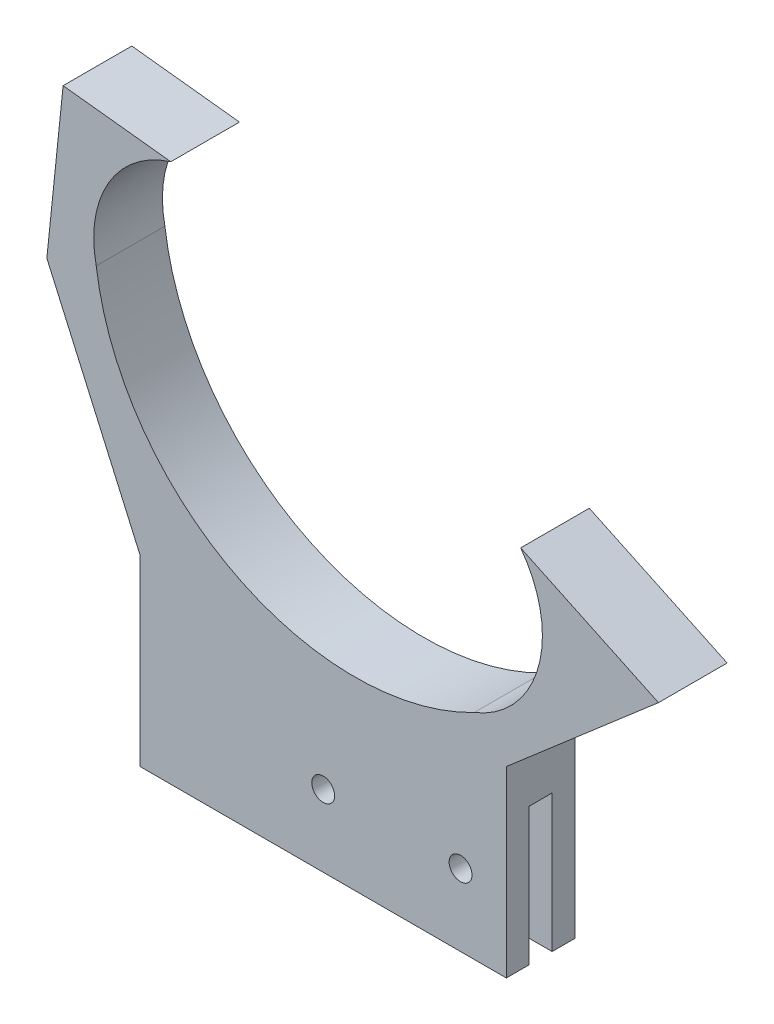
ISO-10303-21;
HEADER;
FILE_DESCRIPTION(('STEP AP214'),'2;1');
FILE_NAME('part.step','',(''),(''),'','','');
FILE_SCHEMA(('AUTOMOTIVE_DESIGN { 1 0 10303 214 1 1 1 1 }'));
ENDSEC;
DATA;
#1=APPLICATION_CONTEXT('core data for automotive mechanical design processes');
#2=APPLICATION_PROTOCOL_DEFINITION('international standard','automotive_design',2000,#1);
#3=PRODUCT_CONTEXT('',#1,'mechanical');
#4=PRODUCT('Part','Part','',(#3));
#5=PRODUCT_RELATED_PRODUCT_CATEGORY('part','',(#4));
#6=PRODUCT_DEFINITION_FORMATION('','',#4);
#7=PRODUCT_DEFINITION_CONTEXT('part definition',#1,'design');
#8=PRODUCT_DEFINITION('design','',#6,#7);
#9=PRODUCT_DEFINITION_SHAPE('','',#8);
#10=(LENGTH_UNIT() NAMED_UNIT(*) SI_UNIT(.MILLI.,.METRE.));
#11=(NAMED_UNIT(*) PLANE_ANGLE_UNIT() SI_UNIT($,.RADIAN.));
#12=(NAMED_UNIT(*) SI_UNIT($,.STERADIAN.) SOLID_ANGLE_UNIT());
#13=UNCERTAINTY_MEASURE_WITH_UNIT(LENGTH_MEASURE(1.E-05),#10,'distance_accuracy_value','');
#14=(GEOMETRIC_REPRESENTATION_CONTEXT(3) GLOBAL_UNCERTAINTY_ASSIGNED_CONTEXT((#13)) GLOBAL_UNIT_ASSIGNED_CONTEXT((#10,
#11,#12)) REPRESENTATION_CONTEXT('',''));
#15=CARTESIAN_POINT('',(0.,0.,0.));
#16=DIRECTION('',(0.,0.,1.));
#17=DIRECTION('',(1.,0.,0.));
#18=AXIS2_PLACEMENT_3D('',#15,#16,#17);
#19=CARTESIAN_POINT('',(0.,0.,-4.7625));
#20=DIRECTION('',(0.,0.,-1.));
#21=DIRECTION('',(-1.,0.,0.));
#22=AXIS2_PLACEMENT_3D('',#19,#20,#21);
#23=PLANE('',#22);
#24=CARTESIAN_POINT('',(25.4,9.97566590254973,-4.7625));
#25=DIRECTION('',(0.,0.,1.));
#26=DIRECTION('',(1.,0.,0.));
#27=AXIS2_PLACEMENT_3D('',#24,#25,#26);
#28=CIRCLE('',#27,1.5875);
#29=CARTESIAN_POINT('',(23.8125,9.97566590254973,-4.7625));
#30=VERTEX_POINT('',#29);
#31=EDGE_CURVE('E327',#30,#30,#28,.T.);
#32=ORIENTED_EDGE('',*,*,#31,.T.);
#33=EDGE_LOOP('',(#32));
#34=FACE_BOUND('',#33,.T.);
#35=DIRECTION('',(0.,1.,0.));
#36=VECTOR('',#35,1.);
#37=CARTESIAN_POINT('',(0.,0.,-4.7625));
#38=LINE('',#37,#36);
#39=CARTESIAN_POINT('',(0.,0.,-4.7625));
#40=VERTEX_POINT('',#39);
#41=CARTESIAN_POINT('',(0.,25.4,-4.7625));
#42=VERTEX_POINT('',#41);
#43=EDGE_CURVE('E351',#40,#42,#38,.T.);
#44=ORIENTED_EDGE('',*,*,#43,.T.);
#45=DIRECTION('',(0.404870913564751,-0.914373853163597,0.));
#46=VECTOR('',#45,1.);
#47=CARTESIAN_POINT('',(0.,25.4,-4.7625));
#48=LINE('',#47,#46);
#49=CARTESIAN_POINT('',(-12.9265765021164,54.5938076271904,-4.7625));
#50=VERTEX_POINT('',#49);
#51=EDGE_CURVE('E223',#50,#42,#48,.T.);
#52=ORIENTED_EDGE('',*,*,#51,.F.);
#53=DIRECTION('',(-0.10275000045706,-0.994707211900102,0.));
#54=VECTOR('',#53,1.);
#55=CARTESIAN_POINT('',(-10.6693086949744,76.4460758215097,-4.7625));
#56=LINE('',#55,#54);
#57=CARTESIAN_POINT('',(-10.6693086949744,76.4460758215097,-4.7625));
#58=VERTEX_POINT('',#57);
#59=EDGE_CURVE('E219',#58,#50,#56,.T.);
#60=ORIENTED_EDGE('',*,*,#59,.F.);
#61=DIRECTION('',(-0.993788616852398,0.111284253219387,0.));
#62=VECTOR('',#61,1.);
#63=CARTESIAN_POINT('',(4.26443102048918,74.7737985949182,-4.7625));
#64=LINE('',#63,#62);
#65=CARTESIAN_POINT('',(4.26443102048918,74.7737985949182,-4.7625));
#66=VERTEX_POINT('',#65);
#67=EDGE_CURVE('E215',#66,#58,#64,.T.);
#68=ORIENTED_EDGE('',*,*,#67,.F.);
#69=CARTESIAN_POINT('',(8.70516464672511,60.3124534404625,-4.7625));
#70=DIRECTION('',(0.,0.,-1.));
#71=DIRECTION('',(-1.,0.,0.));
#72=AXIS2_PLACEMENT_3D('',#69,#70,#71);
#73=CIRCLE('',#72,15.1278094519822);
#74=CARTESIAN_POINT('',(-6.07855098401486,57.1042809131666,-4.7625));
#75=VERTEX_POINT('',#74);
#76=EDGE_CURVE('E199',#75,#66,#73,.T.);
#77=ORIENTED_EDGE('',*,*,#76,.F.);
#78=CARTESIAN_POINT('',(29.7862914139128,61.8197221889093,-4.7625));
#79=DIRECTION('',(0.,0.,-1.));
#80=DIRECTION('',(1.,0.,0.));
#81=AXIS2_PLACEMENT_3D('',#78,#79,#80);
#82=CIRCLE('',#81,36.1735028253163);
#83=CARTESIAN_POINT('',(46.3568676440156,29.664811054597,-4.7625));
#84=VERTEX_POINT('',#83);
#85=EDGE_CURVE('E179',#84,#75,#82,.T.);
#86=ORIENTED_EDGE('',*,*,#85,.F.);
#87=CARTESIAN_POINT('',(40.7687496853365,43.6225751318325,-4.7625));
#88=DIRECTION('',(0.,0.,-1.));
#89=DIRECTION('',(1.,0.,0.));
#90=AXIS2_PLACEMENT_3D('',#87,#88,#89);
#91=CIRCLE('',#90,15.0348342310741);
#92=CARTESIAN_POINT('',(52.7873155231651,52.6558644307344,-4.7625));
#93=VERTEX_POINT('',#92);
#94=EDGE_CURVE('E195',#93,#84,#91,.T.);
#95=ORIENTED_EDGE('',*,*,#94,.F.);
#96=DIRECTION('',(-0.904126563918034,0.427264738093104,0.));
#97=VECTOR('',#96,1.);
#98=CARTESIAN_POINT('',(71.9024825063904,43.6225751318325,-4.7625));
#99=LINE('',#98,#97);
#100=CARTESIAN_POINT('',(71.9024825063904,43.6225751318325,-4.7625));
#101=VERTEX_POINT('',#100);
#102=EDGE_CURVE('E188',#101,#93,#99,.T.);
#103=ORIENTED_EDGE('',*,*,#102,.F.);
#104=DIRECTION('',(0.75686374423358,0.653572698836729,0.));
#105=VECTOR('',#104,1.);
#106=CARTESIAN_POINT('',(50.8,25.4,-4.7625));
#107=LINE('',#106,#105);
#108=CARTESIAN_POINT('',(50.8,25.4,-4.7625));
#109=VERTEX_POINT('',#108);
#110=EDGE_CURVE('E227',#109,#101,#107,.T.);
#111=ORIENTED_EDGE('',*,*,#110,.F.);
#112=DIRECTION('',(0.,1.,0.));
#113=VECTOR('',#112,1.);
#114=CARTESIAN_POINT('',(50.8,0.,-4.7625));
#115=LINE('',#114,#113);
#116=CARTESIAN_POINT('',(50.8,0.,-4.7625));
#117=VERTEX_POINT('',#116);
#118=EDGE_CURVE('E348',#117,#109,#115,.T.);
#119=ORIENTED_EDGE('',*,*,#118,.F.);
#120=DIRECTION('',(1.,0.,0.));
#121=VECTOR('',#120,1.);
#122=CARTESIAN_POINT('',(0.,0.,-4.7625));
#123=LINE('',#122,#121);
#124=EDGE_CURVE('E343',#40,#117,#123,.T.);
#125=ORIENTED_EDGE('',*,*,#124,.F.);
#126=EDGE_LOOP('',(#44,#52,#60,#68,#77,#86,#95,#103,#111,#119,#125));
#127=FACE_BOUND('',#126,.T.);
#128=CARTESIAN_POINT('',(44.45,9.97566590254973,-4.7625));
#129=DIRECTION('',(0.,0.,1.));
#130=DIRECTION('',(1.,0.,0.));
#131=AXIS2_PLACEMENT_3D('',#128,#129,#130);
#132=CIRCLE('',#131,1.5875);
#133=CARTESIAN_POINT('',(42.8625,9.97566590254973,-4.7625));
#134=VERTEX_POINT('',#133);
#135=EDGE_CURVE('E354',#134,#134,#132,.T.);
#136=ORIENTED_EDGE('',*,*,#135,.T.);
#137=EDGE_LOOP('',(#136));
#138=FACE_BOUND('',#137,.T.);
#139=ADVANCED_FACE('F69',(#34,#127,#138),#23,.T.);
#140=CARTESIAN_POINT('',(0.,0.,4.7625));
#141=DIRECTION('',(-1.,0.,0.));
#142=DIRECTION('',(0.,0.,1.));
#143=AXIS2_PLACEMENT_3D('',#140,#141,#142);
#144=PLANE('',#143);
#145=DIRECTION('',(0.,1.,0.));
#146=VECTOR('',#145,1.);
#147=CARTESIAN_POINT('',(0.,0.,-1.5875));
#148=LINE('',#147,#146);
#149=CARTESIAN_POINT('',(0.,0.,-1.5875));
#150=VERTEX_POINT('',#149);
#151=CARTESIAN_POINT('',(0.,19.05,-1.5875));
#152=VERTEX_POINT('',#151);
#153=EDGE_CURVE('E361',#150,#152,#148,.T.);
#154=ORIENTED_EDGE('',*,*,#153,.T.);
#155=DIRECTION('',(0.,0.,1.));
#156=VECTOR('',#155,1.);
#157=CARTESIAN_POINT('',(0.,19.05,-4.7625));
#158=LINE('',#157,#156);
#159=CARTESIAN_POINT('',(0.,19.05,1.5875));
#160=VERTEX_POINT('',#159);
#161=EDGE_CURVE('E322',#152,#160,#158,.T.);
#162=ORIENTED_EDGE('',*,*,#161,.T.);
#163=DIRECTION('',(0.,1.,0.));
#164=VECTOR('',#163,1.);
#165=CARTESIAN_POINT('',(0.,0.,1.5875));
#166=LINE('',#165,#164);
#167=CARTESIAN_POINT('',(0.,0.,1.5875));
#168=VERTEX_POINT('',#167);
#169=EDGE_CURVE('E259',#168,#160,#166,.T.);
#170=ORIENTED_EDGE('',*,*,#169,.F.);
#171=DIRECTION('',(0.,0.,-1.));
#172=VECTOR('',#171,1.);
#173=CARTESIAN_POINT('',(0.,0.,4.7625));
#174=LINE('',#173,#172);
#175=CARTESIAN_POINT('',(0.,0.,4.7625));
#176=VERTEX_POINT('',#175);
#177=EDGE_CURVE('E305',#176,#168,#174,.T.);
#178=ORIENTED_EDGE('',*,*,#177,.F.);
#179=DIRECTION('',(0.,-1.,0.));
#180=VECTOR('',#179,1.);
#181=CARTESIAN_POINT('',(0.,19.05,4.7625));
#182=LINE('',#181,#180);
#183=CARTESIAN_POINT('',(0.,25.4,4.7625));
#184=VERTEX_POINT('',#183);
#185=EDGE_CURVE('E309',#184,#176,#182,.T.);
#186=ORIENTED_EDGE('',*,*,#185,.F.);
#187=DIRECTION('',(0.,0.,1.));
#188=VECTOR('',#187,1.);
#189=CARTESIAN_POINT('',(0.,25.4,-4.7625));
#190=LINE('',#189,#188);
#191=EDGE_CURVE('E323',#42,#184,#190,.T.);
#192=ORIENTED_EDGE('',*,*,#191,.F.);
#193=ORIENTED_EDGE('',*,*,#43,.F.);
#194=DIRECTION('',(0.,0.,-1.));
#195=VECTOR('',#194,1.);
#196=CARTESIAN_POINT('',(0.,0.,4.7625));
#197=LINE('',#196,#195);
#198=EDGE_CURVE('E347',#150,#40,#197,.T.);
#199=ORIENTED_EDGE('',*,*,#198,.F.);
#200=EDGE_LOOP('',(#154,#162,#170,#178,#186,#192,#193,#199));
#201=FACE_BOUND('',#200,.T.);
#202=ADVANCED_FACE('F383',(#201),#144,.T.);
#203=CARTESIAN_POINT('',(0.,0.,4.7625));
#204=DIRECTION('',(0.,1.,0.));
#205=DIRECTION('',(0.,0.,1.));
#206=AXIS2_PLACEMENT_3D('',#203,#204,#205);
#207=PLANE('',#206);
#208=DIRECTION('',(0.,0.,-1.));
#209=VECTOR('',#208,1.);
#210=CARTESIAN_POINT('',(50.8,0.,4.7625));
#211=LINE('',#210,#209);
#212=CARTESIAN_POINT('',(50.8,0.,-1.5875));
#213=VERTEX_POINT('',#212);
#214=EDGE_CURVE('E73',#213,#117,#211,.T.);
#215=ORIENTED_EDGE('',*,*,#214,.F.);
#216=DIRECTION('',(1.,0.,0.));
#217=VECTOR('',#216,1.);
#218=CARTESIAN_POINT('',(0.,0.,-1.5875));
#219=LINE('',#218,#217);
#220=EDGE_CURVE('E79',#150,#213,#219,.T.);
#221=ORIENTED_EDGE('',*,*,#220,.F.);
#222=ORIENTED_EDGE('',*,*,#198,.T.);
#223=ORIENTED_EDGE('',*,*,#124,.T.);
#224=EDGE_LOOP('',(#215,#221,#222,#223));
#225=FACE_BOUND('',#224,.T.);
#226=ADVANCED_FACE('F376',(#225),#207,.F.);
#227=CARTESIAN_POINT('',(50.8,0.,4.7625));
#228=DIRECTION('',(-1.,0.,0.));
#229=DIRECTION('',(0.,0.,1.));
#230=AXIS2_PLACEMENT_3D('',#227,#228,#229);
#231=PLANE('',#230);
#232=ORIENTED_EDGE('',*,*,#118,.T.);
#233=DIRECTION('',(0.,0.,1.));
#234=VECTOR('',#233,1.);
#235=CARTESIAN_POINT('',(50.8,25.4,-4.7625));
#236=LINE('',#235,#234);
#237=CARTESIAN_POINT('',(50.8,25.4,4.7625));
#238=VERTEX_POINT('',#237);
#239=EDGE_CURVE('E328',#109,#238,#236,.T.);
#240=ORIENTED_EDGE('',*,*,#239,.T.);
#241=DIRECTION('',(0.,1.,0.));
#242=VECTOR('',#241,1.);
#243=CARTESIAN_POINT('',(50.8,19.05,4.7625));
#244=LINE('',#243,#242);
#245=CARTESIAN_POINT('',(50.8,0.,4.7625));
#246=VERTEX_POINT('',#245);
#247=EDGE_CURVE('E318',#246,#238,#244,.T.);
#248=ORIENTED_EDGE('',*,*,#247,.F.);
#249=DIRECTION('',(0.,0.,-1.));
#250=VECTOR('',#249,1.);
#251=CARTESIAN_POINT('',(50.8,0.,4.7625));
#252=LINE('',#251,#250);
#253=CARTESIAN_POINT('',(50.8,0.,1.5875));
#254=VERTEX_POINT('',#253);
#255=EDGE_CURVE('E304',#246,#254,#252,.T.);
#256=ORIENTED_EDGE('',*,*,#255,.T.);
#257=DIRECTION('',(0.,1.,0.));
#258=VECTOR('',#257,1.);
#259=CARTESIAN_POINT('',(50.8,0.,1.5875));
#260=LINE('',#259,#258);
#261=CARTESIAN_POINT('',(50.8,19.05,1.5875));
#262=VERTEX_POINT('',#261);
#263=EDGE_CURVE('E279',#254,#262,#260,.T.);
#264=ORIENTED_EDGE('',*,*,#263,.T.);
#265=DIRECTION('',(0.,0.,1.));
#266=VECTOR('',#265,1.);
#267=CARTESIAN_POINT('',(50.8,19.05,-4.7625));
#268=LINE('',#267,#266);
#269=CARTESIAN_POINT('',(50.8,19.05,-1.5875));
#270=VERTEX_POINT('',#269);
#271=EDGE_CURVE('E331',#270,#262,#268,.T.);
#272=ORIENTED_EDGE('',*,*,#271,.F.);
#273=DIRECTION('',(0.,1.,0.));
#274=VECTOR('',#273,1.);
#275=CARTESIAN_POINT('',(50.8,0.,-1.5875));
#276=LINE('',#275,#274);
#277=EDGE_CURVE('E12',#213,#270,#276,.T.);
#278=ORIENTED_EDGE('',*,*,#277,.F.);
#279=ORIENTED_EDGE('',*,*,#214,.T.);
#280=EDGE_LOOP('',(#232,#240,#248,#256,#264,#272,#278,#279));
#281=FACE_BOUND('',#280,.T.);
#282=ADVANCED_FACE('F409',(#281),#231,.F.);
#283=CARTESIAN_POINT('',(25.4,9.97566590254973,4.7625));
#284=DIRECTION('',(0.,0.,-1.));
#285=DIRECTION('',(-1.,0.,0.));
#286=AXIS2_PLACEMENT_3D('',#283,#284,#285);
#287=CYLINDRICAL_SURFACE('',#286,1.5875);
#288=CARTESIAN_POINT('',(25.4,9.97566590254973,-1.5875));
#289=DIRECTION('',(0.,0.,-1.));
#290=DIRECTION('',(-1.,0.,0.));
#291=AXIS2_PLACEMENT_3D('',#288,#289,#290);
#292=CIRCLE('',#291,1.5875);
#293=CARTESIAN_POINT('',(23.8125,9.97566590254973,-1.5875));
#294=VERTEX_POINT('',#293);
#295=EDGE_CURVE('E342',#294,#294,#292,.T.);
#296=CARTESIAN_POINT('',(23.8125,9.97566590254973,-1.5875));
#297=CARTESIAN_POINT('',(23.8125,9.97566590254973,-1.62057291666667));
#298=CARTESIAN_POINT('',(23.8125,9.97566590254973,-1.65364583333333));
#299=CARTESIAN_POINT('',(23.8125,9.97566590254973,-1.71979166666667));
#300=CARTESIAN_POINT('',(23.8125,9.97566590254973,-1.75286458333333));
#301=CARTESIAN_POINT('',(23.8125,9.97566590254973,-1.81901041666667));
#302=CARTESIAN_POINT('',(23.8125,9.97566590254973,-1.85208333333333));
#303=CARTESIAN_POINT('',(23.8125,9.97566590254973,-1.91822916666667));
#304=CARTESIAN_POINT('',(23.8125,9.97566590254973,-1.95130208333333));
#305=CARTESIAN_POINT('',(23.8125,9.97566590254973,-2.01744791666667));
#306=CARTESIAN_POINT('',(23.8125,9.97566590254973,-2.05052083333333));
#307=CARTESIAN_POINT('',(23.8125,9.97566590254973,-2.11666666666667));
#308=CARTESIAN_POINT('',(23.8125,9.97566590254973,-2.14973958333333));
#309=CARTESIAN_POINT('',(23.8125,9.97566590254973,-2.21588541666667));
#310=CARTESIAN_POINT('',(23.8125,9.97566590254973,-2.24895833333333));
#311=CARTESIAN_POINT('',(23.8125,9.97566590254973,-2.31510416666667));
#312=CARTESIAN_POINT('',(23.8125,9.97566590254973,-2.34817708333333));
#313=CARTESIAN_POINT('',(23.8125,9.97566590254973,-2.41432291666667));
#314=CARTESIAN_POINT('',(23.8125,9.97566590254973,-2.44739583333333));
#315=CARTESIAN_POINT('',(23.8125,9.97566590254973,-2.51354166666667));
#316=CARTESIAN_POINT('',(23.8125,9.97566590254973,-2.54661458333333));
#317=CARTESIAN_POINT('',(23.8125,9.97566590254973,-2.61276041666667));
#318=CARTESIAN_POINT('',(23.8125,9.97566590254973,-2.64583333333333));
#319=CARTESIAN_POINT('',(23.8125,9.97566590254973,-2.71197916666667));
#320=CARTESIAN_POINT('',(23.8125,9.97566590254973,-2.74505208333333));
#321=CARTESIAN_POINT('',(23.8125,9.97566590254973,-2.81119791666667));
#322=CARTESIAN_POINT('',(23.8125,9.97566590254973,-2.84427083333333));
#323=CARTESIAN_POINT('',(23.8125,9.97566590254973,-2.91041666666667));
#324=CARTESIAN_POINT('',(23.8125,9.97566590254973,-2.94348958333333));
#325=CARTESIAN_POINT('',(23.8125,9.97566590254973,-3.00963541666667));
#326=CARTESIAN_POINT('',(23.8125,9.97566590254973,-3.04270833333333));
#327=CARTESIAN_POINT('',(23.8125,9.97566590254973,-3.10885416666667));
#328=CARTESIAN_POINT('',(23.8125,9.97566590254973,-3.14192708333333));
#329=CARTESIAN_POINT('',(23.8125,9.97566590254973,-3.20807291666667));
#330=CARTESIAN_POINT('',(23.8125,9.97566590254973,-3.24114583333333));
#331=CARTESIAN_POINT('',(23.8125,9.97566590254973,-3.30729166666667));
#332=CARTESIAN_POINT('',(23.8125,9.97566590254973,-3.34036458333333));
#333=CARTESIAN_POINT('',(23.8125,9.97566590254973,-3.40651041666667));
#334=CARTESIAN_POINT('',(23.8125,9.97566590254973,-3.43958333333333));
#335=CARTESIAN_POINT('',(23.8125,9.97566590254973,-3.50572916666667));
#336=CARTESIAN_POINT('',(23.8125,9.97566590254973,-3.53880208333333));
#337=CARTESIAN_POINT('',(23.8125,9.97566590254973,-3.60494791666667));
#338=CARTESIAN_POINT('',(23.8125,9.97566590254973,-3.63802083333333));
#339=CARTESIAN_POINT('',(23.8125,9.97566590254973,-3.70416666666667));
#340=CARTESIAN_POINT('',(23.8125,9.97566590254973,-3.73723958333333));
#341=CARTESIAN_POINT('',(23.8125,9.97566590254973,-3.80338541666667));
#342=CARTESIAN_POINT('',(23.8125,9.97566590254973,-3.83645833333333));
#343=CARTESIAN_POINT('',(23.8125,9.97566590254973,-3.90260416666667));
#344=CARTESIAN_POINT('',(23.8125,9.97566590254973,-3.93567708333333));
#345=CARTESIAN_POINT('',(23.8125,9.97566590254973,-4.00182291666667));
#346=CARTESIAN_POINT('',(23.8125,9.97566590254973,-4.03489583333333));
#347=CARTESIAN_POINT('',(23.8125,9.97566590254973,-4.10104166666667));
#348=CARTESIAN_POINT('',(23.8125,9.97566590254973,-4.13411458333333));
#349=CARTESIAN_POINT('',(23.8125,9.97566590254973,-4.20026041666667));
#350=CARTESIAN_POINT('',(23.8125,9.97566590254973,-4.23333333333333));
#351=CARTESIAN_POINT('',(23.8125,9.97566590254973,-4.29947916666667));
#352=CARTESIAN_POINT('',(23.8125,9.97566590254973,-4.33255208333333));
#353=CARTESIAN_POINT('',(23.8125,9.97566590254973,-4.39869791666667));
#354=CARTESIAN_POINT('',(23.8125,9.97566590254973,-4.43177083333333));
#355=CARTESIAN_POINT('',(23.8125,9.97566590254973,-4.49791666666667));
#356=CARTESIAN_POINT('',(23.8125,9.97566590254973,-4.53098958333333));
#357=CARTESIAN_POINT('',(23.8125,9.97566590254973,-4.59713541666667));
#358=CARTESIAN_POINT('',(23.8125,9.97566590254973,-4.63020833333333));
#359=CARTESIAN_POINT('',(23.8125,9.97566590254973,-4.69635416666667));
#360=CARTESIAN_POINT('',(23.8125,9.97566590254973,-4.72942708333333));
#361=CARTESIAN_POINT('',(23.8125,9.97566590254973,-4.7625));
#362=B_SPLINE_CURVE_WITH_KNOTS('',3,(#296,#297,#298,#299,#300,#301,#302,#303,#304,#305,#306,
#307,#308,#309,#310,#311,#312,#313,#314,#315,#316,#317,#318,#319,#320,#321,#322,#323,#324,#325,
#326,#327,#328,#329,#330,#331,#332,#333,#334,#335,#336,#337,#338,#339,#340,#341,#342,#343,#344,
#345,#346,#347,#348,#349,#350,#351,#352,#353,#354,#355,#356,#357,#358,#359,#360,#361),
.UNSPECIFIED.,.F.,.F.,(4,2,2,2,2,2,2,2,2,2,2,2,2,2,2,2,2,2,2,2,2,2,2,2,2,2,2,2,2,2,2,2,4),(0.,
0.0992187500000004,0.1984375,0.29765625,0.396875000000001,0.496093750000001,0.5953125,
0.694531250000001,0.793750000000001,0.892968750000001,0.992187500000001,1.09140625,1.190625,
1.28984375,1.3890625,1.48828125,1.5875,1.68671875,1.7859375,1.88515625,1.984375,2.08359375,
2.1828125,2.28203125,2.38125,2.48046875,2.5796875,2.67890625,2.778125,2.87734375,2.9765625,
3.07578125,3.175),.UNSPECIFIED.);
#363=EDGE_CURVE('BSEAM430',#294,#30,#362,.T.);
#364=ORIENTED_EDGE('',*,*,#295,.F.);
#365=ORIENTED_EDGE('',*,*,#31,.F.);
#366=ORIENTED_EDGE('',*,*,#363,.T.);
#367=ORIENTED_EDGE('',*,*,#363,.F.);
#368=EDGE_LOOP('',(#364,#366,#365,#367));
#369=FACE_BOUND('',#368,.T.);
#370=ADVANCED_FACE('F430',(#369),#287,.F.);
#371=CARTESIAN_POINT('',(44.45,9.97566590254973,4.7625));
#372=DIRECTION('',(0.,0.,-1.));
#373=DIRECTION('',(-1.,0.,0.));
#374=AXIS2_PLACEMENT_3D('',#371,#372,#373);
#375=CYLINDRICAL_SURFACE('',#374,1.5875);
#376=CARTESIAN_POINT('',(44.45,9.97566590254973,-1.5875));
#377=DIRECTION('',(0.,0.,-1.));
#378=DIRECTION('',(-1.,0.,0.));
#379=AXIS2_PLACEMENT_3D('',#376,#377,#378);
#380=CIRCLE('',#379,1.5875);
#381=CARTESIAN_POINT('',(42.8625,9.97566590254973,-1.5875));
#382=VERTEX_POINT('',#381);
#383=EDGE_CURVE('E338',#382,#382,#380,.T.);
#384=CARTESIAN_POINT('',(42.8625,9.97566590254973,-1.5875));
#385=CARTESIAN_POINT('',(42.8625,9.97566590254973,-1.62057291666667));
#386=CARTESIAN_POINT('',(42.8625,9.97566590254973,-1.65364583333333));
#387=CARTESIAN_POINT('',(42.8625,9.97566590254973,-1.71979166666667));
#388=CARTESIAN_POINT('',(42.8625,9.97566590254973,-1.75286458333333));
#389=CARTESIAN_POINT('',(42.8625,9.97566590254973,-1.81901041666667));
#390=CARTESIAN_POINT('',(42.8625,9.97566590254973,-1.85208333333333));
#391=CARTESIAN_POINT('',(42.8625,9.97566590254973,-1.91822916666667));
#392=CARTESIAN_POINT('',(42.8625,9.97566590254973,-1.95130208333333));
#393=CARTESIAN_POINT('',(42.8625,9.97566590254973,-2.01744791666667));
#394=CARTESIAN_POINT('',(42.8625,9.97566590254973,-2.05052083333333));
#395=CARTESIAN_POINT('',(42.8625,9.97566590254973,-2.11666666666667));
#396=CARTESIAN_POINT('',(42.8625,9.97566590254973,-2.14973958333333));
#397=CARTESIAN_POINT('',(42.8625,9.97566590254973,-2.21588541666667));
#398=CARTESIAN_POINT('',(42.8625,9.97566590254973,-2.24895833333333));
#399=CARTESIAN_POINT('',(42.8625,9.97566590254973,-2.31510416666667));
#400=CARTESIAN_POINT('',(42.8625,9.97566590254973,-2.34817708333333));
#401=CARTESIAN_POINT('',(42.8625,9.97566590254973,-2.41432291666667));
#402=CARTESIAN_POINT('',(42.8625,9.97566590254973,-2.44739583333333));
#403=CARTESIAN_POINT('',(42.8625,9.97566590254973,-2.51354166666667));
#404=CARTESIAN_POINT('',(42.8625,9.97566590254973,-2.54661458333333));
#405=CARTESIAN_POINT('',(42.8625,9.97566590254973,-2.61276041666667));
#406=CARTESIAN_POINT('',(42.8625,9.97566590254973,-2.64583333333333));
#407=CARTESIAN_POINT('',(42.8625,9.97566590254973,-2.71197916666667));
#408=CARTESIAN_POINT('',(42.8625,9.97566590254973,-2.74505208333333));
#409=CARTESIAN_POINT('',(42.8625,9.97566590254973,-2.81119791666667));
#410=CARTESIAN_POINT('',(42.8625,9.97566590254973,-2.84427083333333));
#411=CARTESIAN_POINT('',(42.8625,9.97566590254973,-2.91041666666667));
#412=CARTESIAN_POINT('',(42.8625,9.97566590254973,-2.94348958333333));
#413=CARTESIAN_POINT('',(42.8625,9.97566590254973,-3.00963541666667));
#414=CARTESIAN_POINT('',(42.8625,9.97566590254973,-3.04270833333333));
#415=CARTESIAN_POINT('',(42.8625,9.97566590254973,-3.10885416666667));
#416=CARTESIAN_POINT('',(42.8625,9.97566590254973,-3.14192708333333));
#417=CARTESIAN_POINT('',(42.8625,9.97566590254973,-3.20807291666667));
#418=CARTESIAN_POINT('',(42.8625,9.97566590254973,-3.24114583333333));
#419=CARTESIAN_POINT('',(42.8625,9.97566590254973,-3.30729166666667));
#420=CARTESIAN_POINT('',(42.8625,9.97566590254973,-3.34036458333333));
#421=CARTESIAN_POINT('',(42.8625,9.97566590254973,-3.40651041666667));
#422=CARTESIAN_POINT('',(42.8625,9.97566590254973,-3.43958333333333));
#423=CARTESIAN_POINT('',(42.8625,9.97566590254973,-3.50572916666667));
#424=CARTESIAN_POINT('',(42.8625,9.97566590254973,-3.53880208333333));
#425=CARTESIAN_POINT('',(42.8625,9.97566590254973,-3.60494791666667));
#426=CARTESIAN_POINT('',(42.8625,9.97566590254973,-3.63802083333333));
#427=CARTESIAN_POINT('',(42.8625,9.97566590254973,-3.70416666666667));
#428=CARTESIAN_POINT('',(42.8625,9.97566590254973,-3.73723958333333));
#429=CARTESIAN_POINT('',(42.8625,9.97566590254973,-3.80338541666667));
#430=CARTESIAN_POINT('',(42.8625,9.97566590254973,-3.83645833333333));
#431=CARTESIAN_POINT('',(42.8625,9.97566590254973,-3.90260416666667));
#432=CARTESIAN_POINT('',(42.8625,9.97566590254973,-3.93567708333333));
#433=CARTESIAN_POINT('',(42.8625,9.97566590254973,-4.00182291666667));
#434=CARTESIAN_POINT('',(42.8625,9.97566590254973,-4.03489583333333));
#435=CARTESIAN_POINT('',(42.8625,9.97566590254973,-4.10104166666667));
#436=CARTESIAN_POINT('',(42.8625,9.97566590254973,-4.13411458333333));
#437=CARTESIAN_POINT('',(42.8625,9.97566590254973,-4.20026041666667));
#438=CARTESIAN_POINT('',(42.8625,9.97566590254973,-4.23333333333333));
#439=CARTESIAN_POINT('',(42.8625,9.97566590254973,-4.29947916666667));
#440=CARTESIAN_POINT('',(42.8625,9.97566590254973,-4.33255208333333));
#441=CARTESIAN_POINT('',(42.8625,9.97566590254973,-4.39869791666667));
#442=CARTESIAN_POINT('',(42.8625,9.97566590254973,-4.43177083333333));
#443=CARTESIAN_POINT('',(42.8625,9.97566590254973,-4.49791666666667));
#444=CARTESIAN_POINT('',(42.8625,9.97566590254973,-4.53098958333333));
#445=CARTESIAN_POINT('',(42.8625,9.97566590254973,-4.59713541666667));
#446=CARTESIAN_POINT('',(42.8625,9.97566590254973,-4.63020833333333));
#447=CARTESIAN_POINT('',(42.8625,9.97566590254973,-4.69635416666667));
#448=CARTESIAN_POINT('',(42.8625,9.97566590254973,-4.72942708333333));
#449=CARTESIAN_POINT('',(42.8625,9.97566590254973,-4.7625));
#450=B_SPLINE_CURVE_WITH_KNOTS('',3,(#384,#385,#386,#387,#388,#389,#390,#391,#392,#393,#394,
#395,#396,#397,#398,#399,#400,#401,#402,#403,#404,#405,#406,#407,#408,#409,#410,#411,#412,#413,
#414,#415,#416,#417,#418,#419,#420,#421,#422,#423,#424,#425,#426,#427,#428,#429,#430,#431,#432,
#433,#434,#435,#436,#437,#438,#439,#440,#441,#442,#443,#444,#445,#446,#447,#448,#449),
.UNSPECIFIED.,.F.,.F.,(4,2,2,2,2,2,2,2,2,2,2,2,2,2,2,2,2,2,2,2,2,2,2,2,2,2,2,2,2,2,2,2,4),(0.,
0.0992187500000004,0.1984375,0.29765625,0.396875000000001,0.496093750000001,0.5953125,
0.694531250000001,0.793750000000001,0.892968750000001,0.992187500000001,1.09140625,1.190625,
1.28984375,1.3890625,1.48828125,1.5875,1.68671875,1.7859375,1.88515625,1.984375,2.08359375,
2.1828125,2.28203125,2.38125,2.48046875,2.5796875,2.67890625,2.778125,2.87734375,2.9765625,
3.07578125,3.175),.UNSPECIFIED.);
#451=EDGE_CURVE('BSEAM71',#382,#134,#450,.T.);
#452=ORIENTED_EDGE('',*,*,#383,.F.);
#453=ORIENTED_EDGE('',*,*,#135,.F.);
#454=ORIENTED_EDGE('',*,*,#451,.T.);
#455=ORIENTED_EDGE('',*,*,#451,.F.);
#456=EDGE_LOOP('',(#452,#454,#453,#455));
#457=FACE_BOUND('',#456,.T.);
#458=ADVANCED_FACE('F71',(#457),#375,.F.);
#459=CARTESIAN_POINT('',(0.,0.,-1.5875));
#460=DIRECTION('',(0.,0.,-1.));
#461=DIRECTION('',(-1.,0.,0.));
#462=AXIS2_PLACEMENT_3D('',#459,#460,#461);
#463=PLANE('',#462);
#464=ORIENTED_EDGE('',*,*,#295,.T.);
#465=EDGE_LOOP('',(#464));
#466=FACE_BOUND('',#465,.T.);
#467=ORIENTED_EDGE('',*,*,#383,.T.);
#468=EDGE_LOOP('',(#467));
#469=FACE_BOUND('',#468,.T.);
#470=ORIENTED_EDGE('',*,*,#153,.F.);
#471=ORIENTED_EDGE('',*,*,#220,.T.);
#472=ORIENTED_EDGE('',*,*,#277,.T.);
#473=DIRECTION('',(1.,0.,0.));
#474=VECTOR('',#473,1.);
#475=CARTESIAN_POINT('',(0.,19.05,-1.5875));
#476=LINE('',#475,#474);
#477=EDGE_CURVE('E86',#152,#270,#476,.T.);
#478=ORIENTED_EDGE('',*,*,#477,.F.);
#479=EDGE_LOOP('',(#470,#471,#472,#478));
#480=FACE_BOUND('',#479,.T.);
#481=ADVANCED_FACE('F421',(#466,#469,#480),#463,.F.);
#482=CARTESIAN_POINT('',(0.,19.05,-4.7625));
#483=DIRECTION('',(0.,-1.,0.));
#484=DIRECTION('',(0.,0.,-1.));
#485=AXIS2_PLACEMENT_3D('',#482,#483,#484);
#486=PLANE('',#485);
#487=DIRECTION('',(1.,0.,0.));
#488=VECTOR('',#487,1.);
#489=CARTESIAN_POINT('',(0.,19.05,1.5875));
#490=LINE('',#489,#488);
#491=EDGE_CURVE('E276',#160,#262,#490,.T.);
#492=ORIENTED_EDGE('',*,*,#491,.F.);
#493=ORIENTED_EDGE('',*,*,#161,.F.);
#494=ORIENTED_EDGE('',*,*,#477,.T.);
#495=ORIENTED_EDGE('',*,*,#271,.T.);
#496=EDGE_LOOP('',(#492,#493,#494,#495));
#497=FACE_BOUND('',#496,.T.);
#498=ADVANCED_FACE('F418',(#497),#486,.T.);
#499=CARTESIAN_POINT('',(0.,0.,4.7625));
#500=DIRECTION('',(0.,0.,-1.));
#501=DIRECTION('',(-1.,0.,0.));
#502=AXIS2_PLACEMENT_3D('',#499,#500,#501);
#503=PLANE('',#502);
#504=ORIENTED_EDGE('',*,*,#185,.T.);
#505=DIRECTION('',(1.,0.,0.));
#506=VECTOR('',#505,1.);
#507=CARTESIAN_POINT('',(0.,0.,4.7625));
#508=LINE('',#507,#506);
#509=EDGE_CURVE('E300',#176,#246,#508,.T.);
#510=ORIENTED_EDGE('',*,*,#509,.T.);
#511=ORIENTED_EDGE('',*,*,#247,.T.);
#512=DIRECTION('',(0.75686374423358,0.653572698836729,0.));
#513=VECTOR('',#512,1.);
#514=CARTESIAN_POINT('',(50.8,25.4,4.7625));
#515=LINE('',#514,#513);
#516=CARTESIAN_POINT('',(71.9024825063904,43.6225751318325,4.7625));
#517=VERTEX_POINT('',#516);
#518=EDGE_CURVE('E210',#238,#517,#515,.T.);
#519=ORIENTED_EDGE('',*,*,#518,.T.);
#520=DIRECTION('',(-0.904126563918034,0.427264738093104,0.));
#521=VECTOR('',#520,1.);
#522=CARTESIAN_POINT('',(71.9024825063904,43.6225751318325,4.7625));
#523=LINE('',#522,#521);
#524=CARTESIAN_POINT('',(52.7873155231651,52.6558644307344,4.7625));
#525=VERTEX_POINT('',#524);
#526=EDGE_CURVE('E205',#517,#525,#523,.T.);
#527=ORIENTED_EDGE('',*,*,#526,.T.);
#528=CARTESIAN_POINT('',(40.7687496853365,43.6225751318325,4.7625));
#529=DIRECTION('',(0.,0.,-1.));
#530=DIRECTION('',(1.,0.,0.));
#531=AXIS2_PLACEMENT_3D('',#528,#529,#530);
#532=CIRCLE('',#531,15.0348342310741);
#533=CARTESIAN_POINT('',(46.3568676440156,29.664811054597,4.7625));
#534=VERTEX_POINT('',#533);
#535=EDGE_CURVE('E233',#525,#534,#532,.T.);
#536=ORIENTED_EDGE('',*,*,#535,.T.);
#537=CARTESIAN_POINT('',(29.7862914139128,61.8197221889093,4.7625));
#538=DIRECTION('',(0.,0.,-1.));
#539=DIRECTION('',(1.,0.,0.));
#540=AXIS2_PLACEMENT_3D('',#537,#538,#539);
#541=CIRCLE('',#540,36.1735028253163);
#542=CARTESIAN_POINT('',(-6.07855098401486,57.1042809131666,4.7625));
#543=VERTEX_POINT('',#542);
#544=EDGE_CURVE('E181',#534,#543,#541,.T.);
#545=ORIENTED_EDGE('',*,*,#544,.T.);
#546=CARTESIAN_POINT('',(8.70516464672511,60.3124534404625,4.7625));
#547=DIRECTION('',(0.,0.,-1.));
#548=DIRECTION('',(-1.,0.,0.));
#549=AXIS2_PLACEMENT_3D('',#546,#547,#548);
#550=CIRCLE('',#549,15.1278094519822);
#551=CARTESIAN_POINT('',(4.26443102048918,74.7737985949182,4.7625));
#552=VERTEX_POINT('',#551);
#553=EDGE_CURVE('E238',#543,#552,#550,.T.);
#554=ORIENTED_EDGE('',*,*,#553,.T.);
#555=DIRECTION('',(-0.993788616852398,0.111284253219387,0.));
#556=VECTOR('',#555,1.);
#557=CARTESIAN_POINT('',(4.26443102048918,74.7737985949182,4.7625));
#558=LINE('',#557,#556);
#559=CARTESIAN_POINT('',(-10.6693086949744,76.4460758215097,4.7625));
#560=VERTEX_POINT('',#559);
#561=EDGE_CURVE('E242',#552,#560,#558,.T.);
#562=ORIENTED_EDGE('',*,*,#561,.T.);
#563=DIRECTION('',(-0.10275000045706,-0.994707211900102,0.));
#564=VECTOR('',#563,1.);
#565=CARTESIAN_POINT('',(-10.6693086949744,76.4460758215097,4.7625));
#566=LINE('',#565,#564);
#567=CARTESIAN_POINT('',(-12.9265765021164,54.5938076271904,4.7625));
#568=VERTEX_POINT('',#567);
#569=EDGE_CURVE('E246',#560,#568,#566,.T.);
#570=ORIENTED_EDGE('',*,*,#569,.T.);
#571=DIRECTION('',(0.404870913564751,-0.914373853163597,0.));
#572=VECTOR('',#571,1.);
#573=CARTESIAN_POINT('',(0.,25.4,4.7625));
#574=LINE('',#573,#572);
#575=EDGE_CURVE('E250',#568,#184,#574,.T.);
#576=ORIENTED_EDGE('',*,*,#575,.T.);
#577=EDGE_LOOP('',(#504,#510,#511,#519,#527,#536,#545,#554,#562,#570,#576));
#578=FACE_BOUND('',#577,.T.);
#579=CARTESIAN_POINT('',(25.4,9.97566590254973,4.7625));
#580=DIRECTION('',(0.,0.,1.));
#581=DIRECTION('',(1.,0.,0.));
#582=AXIS2_PLACEMENT_3D('',#579,#580,#581);
#583=CIRCLE('',#582,1.5875);
#584=CARTESIAN_POINT('',(23.8125,9.97566590254973,4.7625));
#585=VERTEX_POINT('',#584);
#586=EDGE_CURVE('E296',#585,#585,#583,.T.);
#587=ORIENTED_EDGE('',*,*,#586,.F.);
#588=EDGE_LOOP('',(#587));
#589=FACE_BOUND('',#588,.T.);
#590=CARTESIAN_POINT('',(44.45,9.97566590254973,4.7625));
#591=DIRECTION('',(0.,0.,1.));
#592=DIRECTION('',(1.,0.,0.));
#593=AXIS2_PLACEMENT_3D('',#590,#591,#592);
#594=CIRCLE('',#593,1.5875);
#595=CARTESIAN_POINT('',(42.8625,9.97566590254973,4.7625));
#596=VERTEX_POINT('',#595);
#597=EDGE_CURVE('E292',#596,#596,#594,.T.);
#598=ORIENTED_EDGE('',*,*,#597,.F.);
#599=EDGE_LOOP('',(#598));
#600=FACE_BOUND('',#599,.T.);
#601=ADVANCED_FACE('F399',(#578,#589,#600),#503,.F.);
#602=CARTESIAN_POINT('',(25.4,9.97566590254973,4.7625));
#603=DIRECTION('',(0.,0.,-1.));
#604=DIRECTION('',(-1.,0.,0.));
#605=AXIS2_PLACEMENT_3D('',#602,#603,#604);
#606=CYLINDRICAL_SURFACE('',#605,1.5875);
#607=CARTESIAN_POINT('',(25.4,9.97566590254973,1.5875));
#608=DIRECTION('',(0.,0.,-1.));
#609=DIRECTION('',(-1.,0.,0.));
#610=AXIS2_PLACEMENT_3D('',#607,#608,#609);
#611=CIRCLE('',#610,1.5875);
#612=CARTESIAN_POINT('',(23.8125,9.97566590254973,1.5875));
#613=VERTEX_POINT('',#612);
#614=EDGE_CURVE('E288',#613,#613,#611,.T.);
#615=CARTESIAN_POINT('',(23.8125,9.97566590254973,4.7625));
#616=CARTESIAN_POINT('',(23.8125,9.97566590254973,4.72942708333333));
#617=CARTESIAN_POINT('',(23.8125,9.97566590254973,4.69635416666667));
#618=CARTESIAN_POINT('',(23.8125,9.97566590254973,4.63020833333333));
#619=CARTESIAN_POINT('',(23.8125,9.97566590254973,4.59713541666667));
#620=CARTESIAN_POINT('',(23.8125,9.97566590254973,4.53098958333333));
#621=CARTESIAN_POINT('',(23.8125,9.97566590254973,4.49791666666667));
#622=CARTESIAN_POINT('',(23.8125,9.97566590254973,4.43177083333333));
#623=CARTESIAN_POINT('',(23.8125,9.97566590254973,4.39869791666667));
#624=CARTESIAN_POINT('',(23.8125,9.97566590254973,4.33255208333333));
#625=CARTESIAN_POINT('',(23.8125,9.97566590254973,4.29947916666667));
#626=CARTESIAN_POINT('',(23.8125,9.97566590254973,4.23333333333333));
#627=CARTESIAN_POINT('',(23.8125,9.97566590254973,4.20026041666667));
#628=CARTESIAN_POINT('',(23.8125,9.97566590254973,4.13411458333333));
#629=CARTESIAN_POINT('',(23.8125,9.97566590254973,4.10104166666667));
#630=CARTESIAN_POINT('',(23.8125,9.97566590254973,4.03489583333333));
#631=CARTESIAN_POINT('',(23.8125,9.97566590254973,4.00182291666667));
#632=CARTESIAN_POINT('',(23.8125,9.97566590254973,3.93567708333333));
#633=CARTESIAN_POINT('',(23.8125,9.97566590254973,3.90260416666667));
#634=CARTESIAN_POINT('',(23.8125,9.97566590254973,3.83645833333333));
#635=CARTESIAN_POINT('',(23.8125,9.97566590254973,3.80338541666667));
#636=CARTESIAN_POINT('',(23.8125,9.97566590254973,3.73723958333333));
#637=CARTESIAN_POINT('',(23.8125,9.97566590254973,3.70416666666667));
#638=CARTESIAN_POINT('',(23.8125,9.97566590254973,3.63802083333333));
#639=CARTESIAN_POINT('',(23.8125,9.97566590254973,3.60494791666667));
#640=CARTESIAN_POINT('',(23.8125,9.97566590254973,3.53880208333333));
#641=CARTESIAN_POINT('',(23.8125,9.97566590254973,3.50572916666667));
#642=CARTESIAN_POINT('',(23.8125,9.97566590254973,3.43958333333333));
#643=CARTESIAN_POINT('',(23.8125,9.97566590254973,3.40651041666667));
#644=CARTESIAN_POINT('',(23.8125,9.97566590254973,3.34036458333333));
#645=CARTESIAN_POINT('',(23.8125,9.97566590254973,3.30729166666667));
#646=CARTESIAN_POINT('',(23.8125,9.97566590254973,3.24114583333333));
#647=CARTESIAN_POINT('',(23.8125,9.97566590254973,3.20807291666667));
#648=CARTESIAN_POINT('',(23.8125,9.97566590254973,3.14192708333333));
#649=CARTESIAN_POINT('',(23.8125,9.97566590254973,3.10885416666667));
#650=CARTESIAN_POINT('',(23.8125,9.97566590254973,3.04270833333333));
#651=CARTESIAN_POINT('',(23.8125,9.97566590254973,3.00963541666667));
#652=CARTESIAN_POINT('',(23.8125,9.97566590254973,2.94348958333333));
#653=CARTESIAN_POINT('',(23.8125,9.97566590254973,2.91041666666667));
#654=CARTESIAN_POINT('',(23.8125,9.97566590254973,2.84427083333333));
#655=CARTESIAN_POINT('',(23.8125,9.97566590254973,2.81119791666667));
#656=CARTESIAN_POINT('',(23.8125,9.97566590254973,2.74505208333333));
#657=CARTESIAN_POINT('',(23.8125,9.97566590254973,2.71197916666667));
#658=CARTESIAN_POINT('',(23.8125,9.97566590254973,2.64583333333333));
#659=CARTESIAN_POINT('',(23.8125,9.97566590254973,2.61276041666667));
#660=CARTESIAN_POINT('',(23.8125,9.97566590254973,2.54661458333333));
#661=CARTESIAN_POINT('',(23.8125,9.97566590254973,2.51354166666667));
#662=CARTESIAN_POINT('',(23.8125,9.97566590254973,2.44739583333333));
#663=CARTESIAN_POINT('',(23.8125,9.97566590254973,2.41432291666667));
#664=CARTESIAN_POINT('',(23.8125,9.97566590254973,2.34817708333333));
#665=CARTESIAN_POINT('',(23.8125,9.97566590254973,2.31510416666667));
#666=CARTESIAN_POINT('',(23.8125,9.97566590254973,2.24895833333333));
#667=CARTESIAN_POINT('',(23.8125,9.97566590254973,2.21588541666667));
#668=CARTESIAN_POINT('',(23.8125,9.97566590254973,2.14973958333333));
#669=CARTESIAN_POINT('',(23.8125,9.97566590254973,2.11666666666667));
#670=CARTESIAN_POINT('',(23.8125,9.97566590254973,2.05052083333333));
#671=CARTESIAN_POINT('',(23.8125,9.97566590254973,2.01744791666667));
#672=CARTESIAN_POINT('',(23.8125,9.97566590254973,1.95130208333333));
#673=CARTESIAN_POINT('',(23.8125,9.97566590254973,1.91822916666667));
#674=CARTESIAN_POINT('',(23.8125,9.97566590254973,1.85208333333333));
#675=CARTESIAN_POINT('',(23.8125,9.97566590254973,1.81901041666667));
#676=CARTESIAN_POINT('',(23.8125,9.97566590254973,1.75286458333333));
#677=CARTESIAN_POINT('',(23.8125,9.97566590254973,1.71979166666667));
#678=CARTESIAN_POINT('',(23.8125,9.97566590254973,1.65364583333333));
#679=CARTESIAN_POINT('',(23.8125,9.97566590254973,1.62057291666667));
#680=CARTESIAN_POINT('',(23.8125,9.97566590254973,1.5875));
#681=B_SPLINE_CURVE_WITH_KNOTS('',3,(#615,#616,#617,#618,#619,#620,#621,#622,#623,#624,#625,
#626,#627,#628,#629,#630,#631,#632,#633,#634,#635,#636,#637,#638,#639,#640,#641,#642,#643,#644,
#645,#646,#647,#648,#649,#650,#651,#652,#653,#654,#655,#656,#657,#658,#659,#660,#661,#662,#663,
#664,#665,#666,#667,#668,#669,#670,#671,#672,#673,#674,#675,#676,#677,#678,#679,#680),
.UNSPECIFIED.,.F.,.F.,(4,2,2,2,2,2,2,2,2,2,2,2,2,2,2,2,2,2,2,2,2,2,2,2,2,2,2,2,2,2,2,2,4),(0.,
0.0992187500000004,0.198437500000001,0.29765625,0.396875000000001,0.49609375,0.5953125,
0.694531250000001,0.79375,0.892968750000001,0.9921875,1.09140625,1.190625,1.28984375,1.3890625,
1.48828125,1.5875,1.68671875,1.7859375,1.88515625,1.984375,2.08359375,2.1828125,2.28203125,
2.38125,2.48046875,2.5796875,2.67890625,2.778125,2.87734375,2.9765625,3.07578125,3.175),.UNSPECIFIED.);
#682=EDGE_CURVE('BSEAM443',#585,#613,#681,.T.);
#683=ORIENTED_EDGE('',*,*,#586,.T.);
#684=ORIENTED_EDGE('',*,*,#614,.T.);
#685=ORIENTED_EDGE('',*,*,#682,.T.);
#686=ORIENTED_EDGE('',*,*,#682,.F.);
#687=EDGE_LOOP('',(#683,#685,#684,#686));
#688=FACE_BOUND('',#687,.T.);
#689=ADVANCED_FACE('F443',(#688),#606,.F.);
#690=CARTESIAN_POINT('',(0.,0.,4.7625));
#691=DIRECTION('',(0.,1.,0.));
#692=DIRECTION('',(0.,0.,1.));
#693=AXIS2_PLACEMENT_3D('',#690,#691,#692);
#694=PLANE('',#693);
#695=DIRECTION('',(1.,0.,0.));
#696=VECTOR('',#695,1.);
#697=CARTESIAN_POINT('',(0.,0.,1.5875));
#698=LINE('',#697,#696);
#699=EDGE_CURVE('E283',#168,#254,#698,.T.);
#700=ORIENTED_EDGE('',*,*,#699,.T.);
#701=ORIENTED_EDGE('',*,*,#255,.F.);
#702=ORIENTED_EDGE('',*,*,#509,.F.);
#703=ORIENTED_EDGE('',*,*,#177,.T.);
#704=EDGE_LOOP('',(#700,#701,#702,#703));
#705=FACE_BOUND('',#704,.T.);
#706=ADVANCED_FACE('F413',(#705),#694,.F.);
#707=CARTESIAN_POINT('',(44.45,9.97566590254973,4.7625));
#708=DIRECTION('',(0.,0.,-1.));
#709=DIRECTION('',(-1.,0.,0.));
#710=AXIS2_PLACEMENT_3D('',#707,#708,#709);
#711=CYLINDRICAL_SURFACE('',#710,1.5875);
#712=CARTESIAN_POINT('',(44.45,9.97566590254973,1.5875));
#713=DIRECTION('',(0.,0.,-1.));
#714=DIRECTION('',(-1.,0.,0.));
#715=AXIS2_PLACEMENT_3D('',#712,#713,#714);
#716=CIRCLE('',#715,1.5875);
#717=CARTESIAN_POINT('',(42.8625,9.97566590254973,1.5875));
#718=VERTEX_POINT('',#717);
#719=EDGE_CURVE('E287',#718,#718,#716,.T.);
#720=CARTESIAN_POINT('',(42.8625,9.97566590254973,4.7625));
#721=CARTESIAN_POINT('',(42.8625,9.97566590254973,4.72942708333333));
#722=CARTESIAN_POINT('',(42.8625,9.97566590254973,4.69635416666667));
#723=CARTESIAN_POINT('',(42.8625,9.97566590254973,4.63020833333333));
#724=CARTESIAN_POINT('',(42.8625,9.97566590254973,4.59713541666667));
#725=CARTESIAN_POINT('',(42.8625,9.97566590254973,4.53098958333333));
#726=CARTESIAN_POINT('',(42.8625,9.97566590254973,4.49791666666667));
#727=CARTESIAN_POINT('',(42.8625,9.97566590254973,4.43177083333333));
#728=CARTESIAN_POINT('',(42.8625,9.97566590254973,4.39869791666667));
#729=CARTESIAN_POINT('',(42.8625,9.97566590254973,4.33255208333333));
#730=CARTESIAN_POINT('',(42.8625,9.97566590254973,4.29947916666667));
#731=CARTESIAN_POINT('',(42.8625,9.97566590254973,4.23333333333333));
#732=CARTESIAN_POINT('',(42.8625,9.97566590254973,4.20026041666667));
#733=CARTESIAN_POINT('',(42.8625,9.97566590254973,4.13411458333333));
#734=CARTESIAN_POINT('',(42.8625,9.97566590254973,4.10104166666667));
#735=CARTESIAN_POINT('',(42.8625,9.97566590254973,4.03489583333333));
#736=CARTESIAN_POINT('',(42.8625,9.97566590254973,4.00182291666667));
#737=CARTESIAN_POINT('',(42.8625,9.97566590254973,3.93567708333333));
#738=CARTESIAN_POINT('',(42.8625,9.97566590254973,3.90260416666667));
#739=CARTESIAN_POINT('',(42.8625,9.97566590254973,3.83645833333333));
#740=CARTESIAN_POINT('',(42.8625,9.97566590254973,3.80338541666667));
#741=CARTESIAN_POINT('',(42.8625,9.97566590254973,3.73723958333333));
#742=CARTESIAN_POINT('',(42.8625,9.97566590254973,3.70416666666667));
#743=CARTESIAN_POINT('',(42.8625,9.97566590254973,3.63802083333333));
#744=CARTESIAN_POINT('',(42.8625,9.97566590254973,3.60494791666667));
#745=CARTESIAN_POINT('',(42.8625,9.97566590254973,3.53880208333333));
#746=CARTESIAN_POINT('',(42.8625,9.97566590254973,3.50572916666667));
#747=CARTESIAN_POINT('',(42.8625,9.97566590254973,3.43958333333333));
#748=CARTESIAN_POINT('',(42.8625,9.97566590254973,3.40651041666667));
#749=CARTESIAN_POINT('',(42.8625,9.97566590254973,3.34036458333333));
#750=CARTESIAN_POINT('',(42.8625,9.97566590254973,3.30729166666667));
#751=CARTESIAN_POINT('',(42.8625,9.97566590254973,3.24114583333333));
#752=CARTESIAN_POINT('',(42.8625,9.97566590254973,3.20807291666667));
#753=CARTESIAN_POINT('',(42.8625,9.97566590254973,3.14192708333333));
#754=CARTESIAN_POINT('',(42.8625,9.97566590254973,3.10885416666667));
#755=CARTESIAN_POINT('',(42.8625,9.97566590254973,3.04270833333333));
#756=CARTESIAN_POINT('',(42.8625,9.97566590254973,3.00963541666667));
#757=CARTESIAN_POINT('',(42.8625,9.97566590254973,2.94348958333333));
#758=CARTESIAN_POINT('',(42.8625,9.97566590254973,2.91041666666667));
#759=CARTESIAN_POINT('',(42.8625,9.97566590254973,2.84427083333333));
#760=CARTESIAN_POINT('',(42.8625,9.97566590254973,2.81119791666667));
#761=CARTESIAN_POINT('',(42.8625,9.97566590254973,2.74505208333333));
#762=CARTESIAN_POINT('',(42.8625,9.97566590254973,2.71197916666667));
#763=CARTESIAN_POINT('',(42.8625,9.97566590254973,2.64583333333333));
#764=CARTESIAN_POINT('',(42.8625,9.97566590254973,2.61276041666667));
#765=CARTESIAN_POINT('',(42.8625,9.97566590254973,2.54661458333333));
#766=CARTESIAN_POINT('',(42.8625,9.97566590254973,2.51354166666667));
#767=CARTESIAN_POINT('',(42.8625,9.97566590254973,2.44739583333333));
#768=CARTESIAN_POINT('',(42.8625,9.97566590254973,2.41432291666667));
#769=CARTESIAN_POINT('',(42.8625,9.97566590254973,2.34817708333333));
#770=CARTESIAN_POINT('',(42.8625,9.97566590254973,2.31510416666667));
#771=CARTESIAN_POINT('',(42.8625,9.97566590254973,2.24895833333333));
#772=CARTESIAN_POINT('',(42.8625,9.97566590254973,2.21588541666667));
#773=CARTESIAN_POINT('',(42.8625,9.97566590254973,2.14973958333333));
#774=CARTESIAN_POINT('',(42.8625,9.97566590254973,2.11666666666667));
#775=CARTESIAN_POINT('',(42.8625,9.97566590254973,2.05052083333333));
#776=CARTESIAN_POINT('',(42.8625,9.97566590254973,2.01744791666667));
#777=CARTESIAN_POINT('',(42.8625,9.97566590254973,1.95130208333333));
#778=CARTESIAN_POINT('',(42.8625,9.97566590254973,1.91822916666667));
#779=CARTESIAN_POINT('',(42.8625,9.97566590254973,1.85208333333333));
#780=CARTESIAN_POINT('',(42.8625,9.97566590254973,1.81901041666667));
#781=CARTESIAN_POINT('',(42.8625,9.97566590254973,1.75286458333333));
#782=CARTESIAN_POINT('',(42.8625,9.97566590254973,1.71979166666667));
#783=CARTESIAN_POINT('',(42.8625,9.97566590254973,1.65364583333333));
#784=CARTESIAN_POINT('',(42.8625,9.97566590254973,1.62057291666667));
#785=CARTESIAN_POINT('',(42.8625,9.97566590254973,1.5875));
#786=B_SPLINE_CURVE_WITH_KNOTS('',3,(#720,#721,#722,#723,#724,#725,#726,#727,#728,#729,#730,
#731,#732,#733,#734,#735,#736,#737,#738,#739,#740,#741,#742,#743,#744,#745,#746,#747,#748,#749,
#750,#751,#752,#753,#754,#755,#756,#757,#758,#759,#760,#761,#762,#763,#764,#765,#766,#767,#768,
#769,#770,#771,#772,#773,#774,#775,#776,#777,#778,#779,#780,#781,#782,#783,#784,#785),
.UNSPECIFIED.,.F.,.F.,(4,2,2,2,2,2,2,2,2,2,2,2,2,2,2,2,2,2,2,2,2,2,2,2,2,2,2,2,2,2,2,2,4),(0.,
0.0992187500000004,0.198437500000001,0.29765625,0.396875000000001,0.49609375,0.5953125,
0.694531250000001,0.79375,0.892968750000001,0.9921875,1.09140625,1.190625,1.28984375,1.3890625,
1.48828125,1.5875,1.68671875,1.7859375,1.88515625,1.984375,2.08359375,2.1828125,2.28203125,
2.38125,2.48046875,2.5796875,2.67890625,2.778125,2.87734375,2.9765625,3.07578125,3.175),.UNSPECIFIED.);
#787=EDGE_CURVE('BSEAM446',#596,#718,#786,.T.);
#788=ORIENTED_EDGE('',*,*,#597,.T.);
#789=ORIENTED_EDGE('',*,*,#719,.T.);
#790=ORIENTED_EDGE('',*,*,#787,.T.);
#791=ORIENTED_EDGE('',*,*,#787,.F.);
#792=EDGE_LOOP('',(#788,#790,#789,#791));
#793=FACE_BOUND('',#792,.T.);
#794=ADVANCED_FACE('F446',(#793),#711,.F.);
#795=CARTESIAN_POINT('',(0.,0.,1.5875));
#796=DIRECTION('',(0.,0.,-1.));
#797=DIRECTION('',(-1.,0.,0.));
#798=AXIS2_PLACEMENT_3D('',#795,#796,#797);
#799=PLANE('',#798);
#800=ORIENTED_EDGE('',*,*,#614,.F.);
#801=EDGE_LOOP('',(#800));
#802=FACE_BOUND('',#801,.T.);
#803=ORIENTED_EDGE('',*,*,#719,.F.);
#804=EDGE_LOOP('',(#803));
#805=FACE_BOUND('',#804,.T.);
#806=ORIENTED_EDGE('',*,*,#169,.T.);
#807=ORIENTED_EDGE('',*,*,#491,.T.);
#808=ORIENTED_EDGE('',*,*,#263,.F.);
#809=ORIENTED_EDGE('',*,*,#699,.F.);
#810=EDGE_LOOP('',(#806,#807,#808,#809));
#811=FACE_BOUND('',#810,.T.);
#812=ADVANCED_FACE('F452',(#802,#805,#811),#799,.T.);
#813=CARTESIAN_POINT('',(40.7687496853365,43.6225751318325,-4.7625));
#814=DIRECTION('',(0.,0.,1.));
#815=DIRECTION('',(1.,0.,0.));
#816=AXIS2_PLACEMENT_3D('',#813,#814,#815);
#817=CYLINDRICAL_SURFACE('',#816,15.0348342310741);
#818=ORIENTED_EDGE('',*,*,#535,.F.);
#819=DIRECTION('',(0.,0.,1.));
#820=VECTOR('',#819,1.);
#821=CARTESIAN_POINT('',(52.7873155231651,52.6558644307344,-4.7625));
#822=LINE('',#821,#820);
#823=EDGE_CURVE('E203',#93,#525,#822,.T.);
#824=ORIENTED_EDGE('',*,*,#823,.F.);
#825=ORIENTED_EDGE('',*,*,#94,.T.);
#826=DIRECTION('',(0.,0.,1.));
#827=VECTOR('',#826,1.);
#828=CARTESIAN_POINT('',(46.3568676440156,29.664811054597,-4.7625));
#829=LINE('',#828,#827);
#830=EDGE_CURVE('E176',#84,#534,#829,.T.);
#831=ORIENTED_EDGE('',*,*,#830,.T.);
#832=EDGE_LOOP('',(#818,#824,#825,#831));
#833=FACE_BOUND('',#832,.T.);
#834=ADVANCED_FACE('F202',(#833),#817,.F.);
#835=CARTESIAN_POINT('',(71.9024825063904,43.6225751318325,-4.7625));
#836=DIRECTION('',(0.427264738093104,0.904126563918034,0.));
#837=DIRECTION('',(-0.904126563918034,0.427264738093104,0.));
#838=AXIS2_PLACEMENT_3D('',#835,#836,#837);
#839=PLANE('',#838);
#840=ORIENTED_EDGE('',*,*,#526,.F.);
#841=DIRECTION('',(0.,0.,1.));
#842=VECTOR('',#841,1.);
#843=CARTESIAN_POINT('',(71.9024825063904,43.6225751318325,-4.7625));
#844=LINE('',#843,#842);
#845=EDGE_CURVE('E260',#101,#517,#844,.T.);
#846=ORIENTED_EDGE('',*,*,#845,.F.);
#847=ORIENTED_EDGE('',*,*,#102,.T.);
#848=ORIENTED_EDGE('',*,*,#823,.T.);
#849=EDGE_LOOP('',(#840,#846,#847,#848));
#850=FACE_BOUND('',#849,.T.);
#851=ADVANCED_FACE('F404',(#850),#839,.T.);
#852=CARTESIAN_POINT('',(50.8,25.4,-4.7625));
#853=DIRECTION('',(0.653572698836729,-0.75686374423358,0.));
#854=DIRECTION('',(0.75686374423358,0.653572698836729,0.));
#855=AXIS2_PLACEMENT_3D('',#852,#853,#854);
#856=PLANE('',#855);
#857=ORIENTED_EDGE('',*,*,#518,.F.);
#858=ORIENTED_EDGE('',*,*,#239,.F.);
#859=ORIENTED_EDGE('',*,*,#110,.T.);
#860=ORIENTED_EDGE('',*,*,#845,.T.);
#861=EDGE_LOOP('',(#857,#858,#859,#860));
#862=FACE_BOUND('',#861,.T.);
#863=ADVANCED_FACE('F407',(#862),#856,.T.);
#864=CARTESIAN_POINT('',(0.,25.4,-4.7625));
#865=DIRECTION('',(-0.914373853163597,-0.404870913564751,0.));
#866=DIRECTION('',(0.404870913564751,-0.914373853163597,0.));
#867=AXIS2_PLACEMENT_3D('',#864,#865,#866);
#868=PLANE('',#867);
#869=ORIENTED_EDGE('',*,*,#575,.F.);
#870=DIRECTION('',(0.,0.,1.));
#871=VECTOR('',#870,1.);
#872=CARTESIAN_POINT('',(-12.9265765021164,54.5938076271904,-4.7625));
#873=LINE('',#872,#871);
#874=EDGE_CURVE('E263',#50,#568,#873,.T.);
#875=ORIENTED_EDGE('',*,*,#874,.F.);
#876=ORIENTED_EDGE('',*,*,#51,.T.);
#877=ORIENTED_EDGE('',*,*,#191,.T.);
#878=EDGE_LOOP('',(#869,#875,#876,#877));
#879=FACE_BOUND('',#878,.T.);
#880=ADVANCED_FACE('F387',(#879),#868,.T.);
#881=CARTESIAN_POINT('',(-10.6693086949744,76.4460758215097,-4.7625));
#882=DIRECTION('',(-0.994707211900102,0.10275000045706,0.));
#883=DIRECTION('',(-0.10275000045706,-0.994707211900102,0.));
#884=AXIS2_PLACEMENT_3D('',#881,#882,#883);
#885=PLANE('',#884);
#886=ORIENTED_EDGE('',*,*,#569,.F.);
#887=DIRECTION('',(0.,0.,1.));
#888=VECTOR('',#887,1.);
#889=CARTESIAN_POINT('',(-10.6693086949744,76.4460758215097,-4.7625));
#890=LINE('',#889,#888);
#891=EDGE_CURVE('E266',#58,#560,#890,.T.);
#892=ORIENTED_EDGE('',*,*,#891,.F.);
#893=ORIENTED_EDGE('',*,*,#59,.T.);
#894=ORIENTED_EDGE('',*,*,#874,.T.);
#895=EDGE_LOOP('',(#886,#892,#893,#894));
#896=FACE_BOUND('',#895,.T.);
#897=ADVANCED_FACE('F391',(#896),#885,.T.);
#898=CARTESIAN_POINT('',(4.26443102048918,74.7737985949182,-4.7625));
#899=DIRECTION('',(0.111284253219387,0.993788616852399,0.));
#900=DIRECTION('',(-0.993788616852399,0.111284253219387,0.));
#901=AXIS2_PLACEMENT_3D('',#898,#899,#900);
#902=PLANE('',#901);
#903=ORIENTED_EDGE('',*,*,#561,.F.);
#904=DIRECTION('',(0.,0.,1.));
#905=VECTOR('',#904,1.);
#906=CARTESIAN_POINT('',(4.26443102048918,74.7737985949182,-4.7625));
#907=LINE('',#906,#905);
#908=EDGE_CURVE('E269',#66,#552,#907,.T.);
#909=ORIENTED_EDGE('',*,*,#908,.F.);
#910=ORIENTED_EDGE('',*,*,#67,.T.);
#911=ORIENTED_EDGE('',*,*,#891,.T.);
#912=EDGE_LOOP('',(#903,#909,#910,#911));
#913=FACE_BOUND('',#912,.T.);
#914=ADVANCED_FACE('F394',(#913),#902,.T.);
#915=CARTESIAN_POINT('',(8.70516464672511,60.3124534404625,-4.7625));
#916=DIRECTION('',(0.,0.,1.));
#917=DIRECTION('',(1.,0.,0.));
#918=AXIS2_PLACEMENT_3D('',#915,#916,#917);
#919=CYLINDRICAL_SURFACE('',#918,15.1278094519822);
#920=ORIENTED_EDGE('',*,*,#553,.F.);
#921=DIRECTION('',(0.,0.,1.));
#922=VECTOR('',#921,1.);
#923=CARTESIAN_POINT('',(-6.07855098401486,57.1042809131666,-4.7625));
#924=LINE('',#923,#922);
#925=EDGE_CURVE('E187',#75,#543,#924,.T.);
#926=ORIENTED_EDGE('',*,*,#925,.F.);
#927=ORIENTED_EDGE('',*,*,#76,.T.);
#928=ORIENTED_EDGE('',*,*,#908,.T.);
#929=EDGE_LOOP('',(#920,#926,#927,#928));
#930=FACE_BOUND('',#929,.T.);
#931=ADVANCED_FACE('F397',(#930),#919,.F.);
#932=CARTESIAN_POINT('',(29.7862914139128,61.8197221889093,-4.7625));
#933=DIRECTION('',(0.,0.,1.));
#934=DIRECTION('',(1.,0.,0.));
#935=AXIS2_PLACEMENT_3D('',#932,#933,#934);
#936=CYLINDRICAL_SURFACE('',#935,36.1735028253163);
#937=ORIENTED_EDGE('',*,*,#544,.F.);
#938=ORIENTED_EDGE('',*,*,#830,.F.);
#939=ORIENTED_EDGE('',*,*,#85,.T.);
#940=ORIENTED_EDGE('',*,*,#925,.T.);
#941=EDGE_LOOP('',(#937,#938,#939,#940));
#942=FACE_BOUND('',#941,.T.);
#943=ADVANCED_FACE('F178',(#942),#936,.F.);
#944=CLOSED_SHELL('',(#139,#202,#226,#282,#370,#458,#481,#498,#601,#689,#706,#794,#812,#834,
#851,#863,#880,#897,#914,#931,#943));
#945=MANIFOLD_SOLID_BREP('B2',#944);
#946=ADVANCED_BREP_SHAPE_REPRESENTATION('',(#18,#945),#14);
#947=SHAPE_DEFINITION_REPRESENTATION(#9,#946);
ENDSEC;
END-ISO-10303-21;
